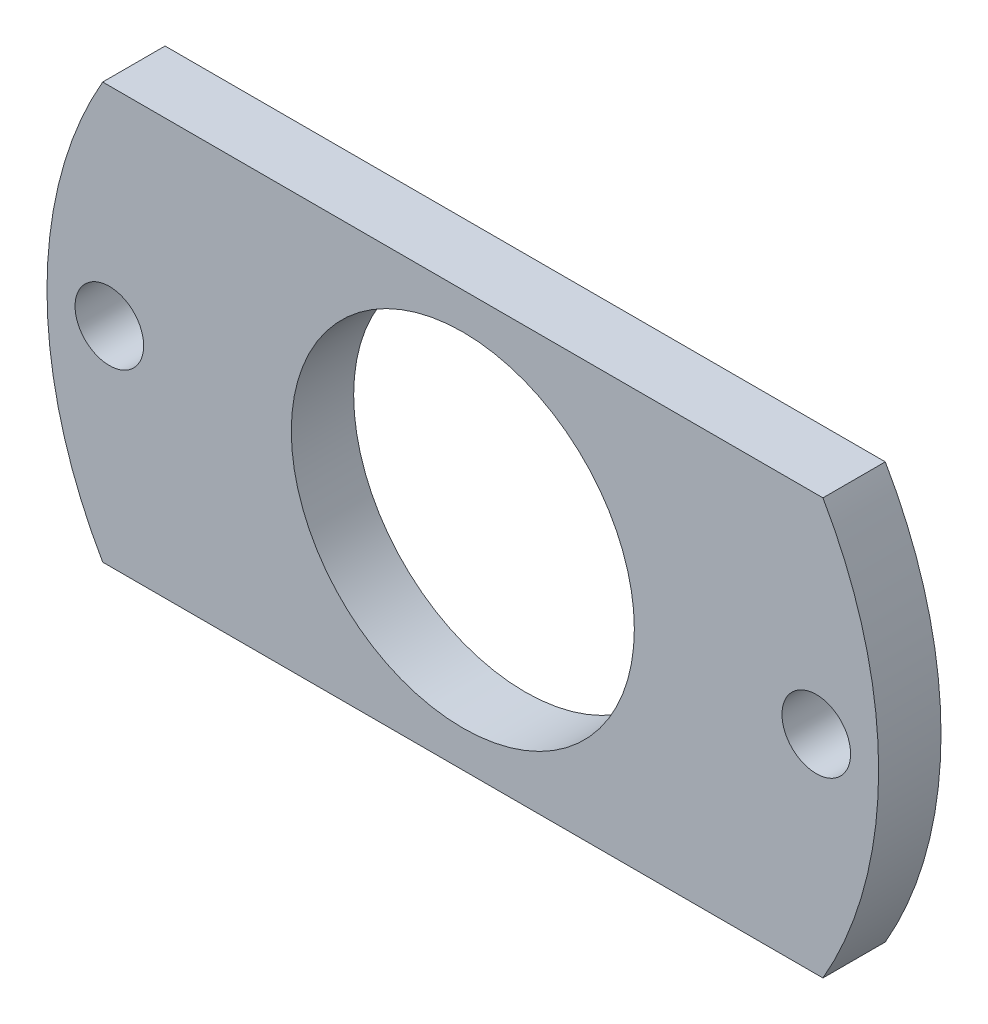
ISO-10303-21;
HEADER;
FILE_DESCRIPTION(('STEP AP214'),'2;1');
FILE_NAME('part.step','',(''),(''),'','','');
FILE_SCHEMA(('AUTOMOTIVE_DESIGN { 1 0 10303 214 1 1 1 1 }'));
ENDSEC;
DATA;
#1=APPLICATION_CONTEXT('core data for automotive mechanical design processes');
#2=APPLICATION_PROTOCOL_DEFINITION('international standard','automotive_design',2000,#1);
#3=PRODUCT_CONTEXT('',#1,'mechanical');
#4=PRODUCT('Part','Part','',(#3));
#5=PRODUCT_RELATED_PRODUCT_CATEGORY('part','',(#4));
#6=PRODUCT_DEFINITION_FORMATION('','',#4);
#7=PRODUCT_DEFINITION_CONTEXT('part definition',#1,'design');
#8=PRODUCT_DEFINITION('design','',#6,#7);
#9=PRODUCT_DEFINITION_SHAPE('','',#8);
#10=(LENGTH_UNIT() NAMED_UNIT(*) SI_UNIT(.MILLI.,.METRE.));
#11=(NAMED_UNIT(*) PLANE_ANGLE_UNIT() SI_UNIT($,.RADIAN.));
#12=(NAMED_UNIT(*) SI_UNIT($,.STERADIAN.) SOLID_ANGLE_UNIT());
#13=UNCERTAINTY_MEASURE_WITH_UNIT(LENGTH_MEASURE(1.E-05),#10,'distance_accuracy_value','');
#14=(GEOMETRIC_REPRESENTATION_CONTEXT(3) GLOBAL_UNCERTAINTY_ASSIGNED_CONTEXT((#13)) GLOBAL_UNIT_ASSIGNED_CONTEXT((#10,
#11,#12)) REPRESENTATION_CONTEXT('',''));
#15=CARTESIAN_POINT('',(0.,0.,0.));
#16=DIRECTION('',(0.,0.,1.));
#17=DIRECTION('',(1.,0.,0.));
#18=AXIS2_PLACEMENT_3D('',#15,#16,#17);
#19=CARTESIAN_POINT('',(0.,10.,3.));
#20=DIRECTION('',(0.,1.,0.));
#21=DIRECTION('',(0.,0.,1.));
#22=AXIS2_PLACEMENT_3D('',#19,#20,#21);
#23=PLANE('',#22);
#24=DIRECTION('',(1.,0.,0.));
#25=VECTOR('',#24,1.);
#26=CARTESIAN_POINT('',(0.,10.,0.));
#27=LINE('',#26,#25);
#28=CARTESIAN_POINT('',(-17.3205080756888,10.,0.));
#29=VERTEX_POINT('',#28);
#30=CARTESIAN_POINT('',(17.3205080756888,10.,0.));
#31=VERTEX_POINT('',#30);
#32=EDGE_CURVE('E106',#29,#31,#27,.T.);
#33=ORIENTED_EDGE('',*,*,#32,.F.);
#34=DIRECTION('',(0.,0.,-1.));
#35=VECTOR('',#34,1.);
#36=CARTESIAN_POINT('',(-17.3205080756888,10.,3.));
#37=LINE('',#36,#35);
#38=CARTESIAN_POINT('',(-17.3205080756888,10.,3.));
#39=VERTEX_POINT('',#38);
#40=EDGE_CURVE('E11',#39,#29,#37,.T.);
#41=ORIENTED_EDGE('',*,*,#40,.F.);
#42=DIRECTION('',(1.,0.,0.));
#43=VECTOR('',#42,1.);
#44=CARTESIAN_POINT('',(0.,10.,3.));
#45=LINE('',#44,#43);
#46=CARTESIAN_POINT('',(17.3205080756888,10.,3.));
#47=VERTEX_POINT('',#46);
#48=EDGE_CURVE('E94',#39,#47,#45,.T.);
#49=ORIENTED_EDGE('',*,*,#48,.T.);
#50=DIRECTION('',(0.,0.,-1.));
#51=VECTOR('',#50,1.);
#52=CARTESIAN_POINT('',(17.3205080756888,10.,3.));
#53=LINE('',#52,#51);
#54=EDGE_CURVE('E76',#47,#31,#53,.T.);
#55=ORIENTED_EDGE('',*,*,#54,.T.);
#56=EDGE_LOOP('',(#33,#41,#49,#55));
#57=FACE_BOUND('',#56,.T.);
#58=ADVANCED_FACE('F37',(#57),#23,.T.);
#59=CARTESIAN_POINT('',(0.,0.,3.));
#60=DIRECTION('',(0.,0.,-1.));
#61=DIRECTION('',(-1.,0.,0.));
#62=AXIS2_PLACEMENT_3D('',#59,#60,#61);
#63=CYLINDRICAL_SURFACE('',#62,20.);
#64=CARTESIAN_POINT('',(0.,0.,0.));
#65=DIRECTION('',(0.,0.,1.));
#66=DIRECTION('',(1.,0.,0.));
#67=AXIS2_PLACEMENT_3D('',#64,#65,#66);
#68=CIRCLE('',#67,20.);
#69=CARTESIAN_POINT('',(-17.3205080756888,-10.,0.));
#70=VERTEX_POINT('',#69);
#71=EDGE_CURVE('E99',#29,#70,#68,.T.);
#72=ORIENTED_EDGE('',*,*,#71,.T.);
#73=DIRECTION('',(0.,0.,-1.));
#74=VECTOR('',#73,1.);
#75=CARTESIAN_POINT('',(-17.3205080756888,-10.,3.));
#76=LINE('',#75,#74);
#77=CARTESIAN_POINT('',(-17.3205080756888,-10.,3.));
#78=VERTEX_POINT('',#77);
#79=EDGE_CURVE('E46',#78,#70,#76,.T.);
#80=ORIENTED_EDGE('',*,*,#79,.F.);
#81=CARTESIAN_POINT('',(0.,0.,3.));
#82=DIRECTION('',(0.,0.,1.));
#83=DIRECTION('',(1.,0.,0.));
#84=AXIS2_PLACEMENT_3D('',#81,#82,#83);
#85=CIRCLE('',#84,20.);
#86=EDGE_CURVE('E91',#39,#78,#85,.T.);
#87=ORIENTED_EDGE('',*,*,#86,.F.);
#88=ORIENTED_EDGE('',*,*,#40,.T.);
#89=EDGE_LOOP('',(#72,#80,#87,#88));
#90=FACE_BOUND('',#89,.T.);
#91=ADVANCED_FACE('F97',(#90),#63,.T.);
#92=CARTESIAN_POINT('',(0.,-10.,3.));
#93=DIRECTION('',(0.,1.,0.));
#94=DIRECTION('',(0.,0.,1.));
#95=AXIS2_PLACEMENT_3D('',#92,#93,#94);
#96=PLANE('',#95);
#97=DIRECTION('',(1.,0.,0.));
#98=VECTOR('',#97,1.);
#99=CARTESIAN_POINT('',(0.,-10.,0.));
#100=LINE('',#99,#98);
#101=CARTESIAN_POINT('',(17.3205080756888,-10.,0.));
#102=VERTEX_POINT('',#101);
#103=EDGE_CURVE('E103',#70,#102,#100,.T.);
#104=ORIENTED_EDGE('',*,*,#103,.T.);
#105=DIRECTION('',(0.,0.,-1.));
#106=VECTOR('',#105,1.);
#107=CARTESIAN_POINT('',(17.3205080756888,-10.,3.));
#108=LINE('',#107,#106);
#109=CARTESIAN_POINT('',(17.3205080756888,-10.,3.));
#110=VERTEX_POINT('',#109);
#111=EDGE_CURVE('E90',#110,#102,#108,.T.);
#112=ORIENTED_EDGE('',*,*,#111,.F.);
#113=DIRECTION('',(1.,0.,0.));
#114=VECTOR('',#113,1.);
#115=CARTESIAN_POINT('',(0.,-10.,3.));
#116=LINE('',#115,#114);
#117=EDGE_CURVE('E84',#78,#110,#116,.T.);
#118=ORIENTED_EDGE('',*,*,#117,.F.);
#119=ORIENTED_EDGE('',*,*,#79,.T.);
#120=EDGE_LOOP('',(#104,#112,#118,#119));
#121=FACE_BOUND('',#120,.T.);
#122=ADVANCED_FACE('F87',(#121),#96,.F.);
#123=CARTESIAN_POINT('',(0.,0.,3.));
#124=DIRECTION('',(0.,0.,-1.));
#125=DIRECTION('',(-1.,0.,0.));
#126=AXIS2_PLACEMENT_3D('',#123,#124,#125);
#127=CYLINDRICAL_SURFACE('',#126,8.25);
#128=CARTESIAN_POINT('',(0.,0.,3.));
#129=DIRECTION('',(0.,0.,1.));
#130=DIRECTION('',(1.,0.,0.));
#131=AXIS2_PLACEMENT_3D('',#128,#129,#130);
#132=CIRCLE('',#131,8.25);
#133=CARTESIAN_POINT('',(8.25,0.,3.));
#134=VERTEX_POINT('',#133);
#135=EDGE_CURVE('E118',#134,#134,#132,.T.);
#136=ORIENTED_EDGE('',*,*,#135,.T.);
#137=EDGE_LOOP('',(#136));
#138=FACE_BOUND('',#137,.T.);
#139=CARTESIAN_POINT('',(0.,0.,0.));
#140=DIRECTION('',(0.,0.,1.));
#141=DIRECTION('',(1.,0.,0.));
#142=AXIS2_PLACEMENT_3D('',#139,#140,#141);
#143=CIRCLE('',#142,8.25);
#144=CARTESIAN_POINT('',(8.25,0.,0.));
#145=VERTEX_POINT('',#144);
#146=EDGE_CURVE('E108',#145,#145,#143,.T.);
#147=ORIENTED_EDGE('',*,*,#146,.F.);
#148=EDGE_LOOP('',(#147));
#149=FACE_BOUND('',#148,.T.);
#150=ADVANCED_FACE('F139',(#138,#149),#127,.F.);
#151=CARTESIAN_POINT('',(-17.,0.,3.));
#152=DIRECTION('',(0.,0.,-1.));
#153=DIRECTION('',(-1.,0.,0.));
#154=AXIS2_PLACEMENT_3D('',#151,#152,#153);
#155=CYLINDRICAL_SURFACE('',#154,1.65);
#156=CARTESIAN_POINT('',(-17.,0.,3.));
#157=DIRECTION('',(0.,0.,1.));
#158=DIRECTION('',(1.,0.,0.));
#159=AXIS2_PLACEMENT_3D('',#156,#157,#158);
#160=CIRCLE('',#159,1.65);
#161=CARTESIAN_POINT('',(-15.35,0.,3.));
#162=VERTEX_POINT('',#161);
#163=EDGE_CURVE('E121',#162,#162,#160,.T.);
#164=ORIENTED_EDGE('',*,*,#163,.T.);
#165=EDGE_LOOP('',(#164));
#166=FACE_BOUND('',#165,.T.);
#167=CARTESIAN_POINT('',(-17.,0.,0.));
#168=DIRECTION('',(0.,0.,1.));
#169=DIRECTION('',(1.,0.,0.));
#170=AXIS2_PLACEMENT_3D('',#167,#168,#169);
#171=CIRCLE('',#170,1.65);
#172=CARTESIAN_POINT('',(-15.35,0.,0.));
#173=VERTEX_POINT('',#172);
#174=EDGE_CURVE('E111',#173,#173,#171,.T.);
#175=ORIENTED_EDGE('',*,*,#174,.F.);
#176=EDGE_LOOP('',(#175));
#177=FACE_BOUND('',#176,.T.);
#178=ADVANCED_FACE('F141',(#166,#177),#155,.F.);
#179=CARTESIAN_POINT('',(17.,0.,3.));
#180=DIRECTION('',(0.,0.,-1.));
#181=DIRECTION('',(-1.,0.,0.));
#182=AXIS2_PLACEMENT_3D('',#179,#180,#181);
#183=CYLINDRICAL_SURFACE('',#182,1.65);
#184=CARTESIAN_POINT('',(17.,0.,3.));
#185=DIRECTION('',(0.,0.,1.));
#186=DIRECTION('',(1.,0.,0.));
#187=AXIS2_PLACEMENT_3D('',#184,#185,#186);
#188=CIRCLE('',#187,1.65);
#189=CARTESIAN_POINT('',(18.65,0.,3.));
#190=VERTEX_POINT('',#189);
#191=EDGE_CURVE('E124',#190,#190,#188,.T.);
#192=ORIENTED_EDGE('',*,*,#191,.T.);
#193=EDGE_LOOP('',(#192));
#194=FACE_BOUND('',#193,.T.);
#195=CARTESIAN_POINT('',(17.,0.,0.));
#196=DIRECTION('',(0.,0.,1.));
#197=DIRECTION('',(1.,0.,0.));
#198=AXIS2_PLACEMENT_3D('',#195,#196,#197);
#199=CIRCLE('',#198,1.65);
#200=CARTESIAN_POINT('',(18.65,0.,0.));
#201=VERTEX_POINT('',#200);
#202=EDGE_CURVE('E114',#201,#201,#199,.T.);
#203=ORIENTED_EDGE('',*,*,#202,.F.);
#204=EDGE_LOOP('',(#203));
#205=FACE_BOUND('',#204,.T.);
#206=ADVANCED_FACE('F39',(#194,#205),#183,.F.);
#207=EDGE_CURVE('E69',#102,#31,#68,.T.);
#208=ORIENTED_EDGE('',*,*,#207,.T.);
#209=ORIENTED_EDGE('',*,*,#54,.F.);
#210=EDGE_CURVE('E54',#110,#47,#85,.T.);
#211=ORIENTED_EDGE('',*,*,#210,.F.);
#212=ORIENTED_EDGE('',*,*,#111,.T.);
#213=EDGE_LOOP('',(#208,#209,#211,#212));
#214=FACE_BOUND('',#213,.T.);
#215=ADVANCED_FACE('F129',(#214),#63,.T.);
#216=CARTESIAN_POINT('',(0.,0.,3.));
#217=DIRECTION('',(0.,0.,1.));
#218=DIRECTION('',(1.,0.,0.));
#219=AXIS2_PLACEMENT_3D('',#216,#217,#218);
#220=PLANE('',#219);
#221=ORIENTED_EDGE('',*,*,#191,.F.);
#222=EDGE_LOOP('',(#221));
#223=FACE_BOUND('',#222,.T.);
#224=ORIENTED_EDGE('',*,*,#163,.F.);
#225=EDGE_LOOP('',(#224));
#226=FACE_BOUND('',#225,.T.);
#227=ORIENTED_EDGE('',*,*,#135,.F.);
#228=EDGE_LOOP('',(#227));
#229=FACE_BOUND('',#228,.T.);
#230=ORIENTED_EDGE('',*,*,#48,.F.);
#231=ORIENTED_EDGE('',*,*,#86,.T.);
#232=ORIENTED_EDGE('',*,*,#117,.T.);
#233=ORIENTED_EDGE('',*,*,#210,.T.);
#234=EDGE_LOOP('',(#230,#231,#232,#233));
#235=FACE_BOUND('',#234,.T.);
#236=ADVANCED_FACE('F93',(#223,#226,#229,#235),#220,.T.);
#237=CARTESIAN_POINT('',(0.,0.,0.));
#238=DIRECTION('',(0.,0.,1.));
#239=DIRECTION('',(1.,0.,0.));
#240=AXIS2_PLACEMENT_3D('',#237,#238,#239);
#241=PLANE('',#240);
#242=ORIENTED_EDGE('',*,*,#202,.T.);
#243=EDGE_LOOP('',(#242));
#244=FACE_BOUND('',#243,.T.);
#245=ORIENTED_EDGE('',*,*,#174,.T.);
#246=EDGE_LOOP('',(#245));
#247=FACE_BOUND('',#246,.T.);
#248=ORIENTED_EDGE('',*,*,#146,.T.);
#249=EDGE_LOOP('',(#248));
#250=FACE_BOUND('',#249,.T.);
#251=ORIENTED_EDGE('',*,*,#32,.T.);
#252=ORIENTED_EDGE('',*,*,#207,.F.);
#253=ORIENTED_EDGE('',*,*,#103,.F.);
#254=ORIENTED_EDGE('',*,*,#71,.F.);
#255=EDGE_LOOP('',(#251,#252,#253,#254));
#256=FACE_BOUND('',#255,.T.);
#257=ADVANCED_FACE('F130',(#244,#247,#250,#256),#241,.F.);
#258=CLOSED_SHELL('',(#58,#91,#122,#150,#178,#206,#215,#236,#257));
#259=MANIFOLD_SOLID_BREP('B2',#258);
#260=ADVANCED_BREP_SHAPE_REPRESENTATION('',(#18,#259),#14);
#261=SHAPE_DEFINITION_REPRESENTATION(#9,#260);
ENDSEC;
END-ISO-10303-21;
